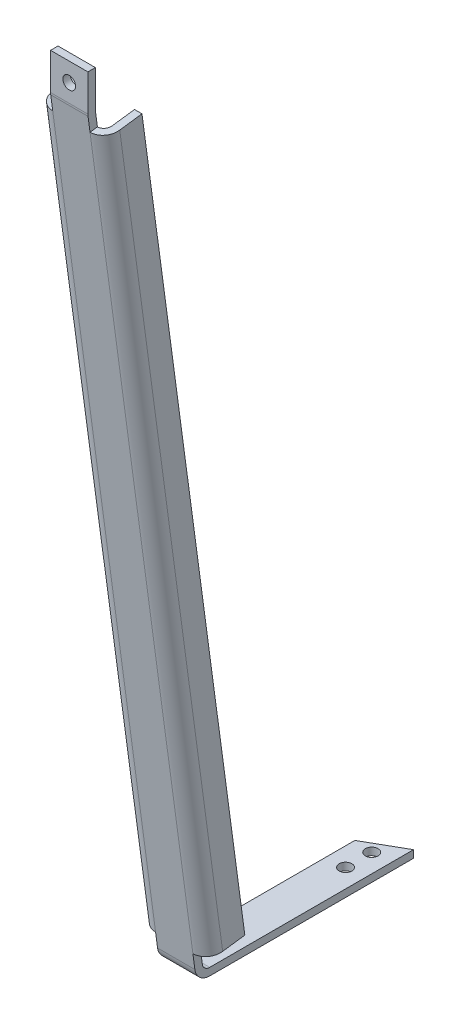
ISO-10303-21;
HEADER;
FILE_DESCRIPTION(('STEP AP214'),'2;1');
FILE_NAME('part.step','',(''),(''),'','','');
FILE_SCHEMA(('AUTOMOTIVE_DESIGN { 1 0 10303 214 1 1 1 1 }'));
ENDSEC;
DATA;
#1=APPLICATION_CONTEXT('core data for automotive mechanical design processes');
#2=APPLICATION_PROTOCOL_DEFINITION('international standard','automotive_design',2000,#1);
#3=PRODUCT_CONTEXT('',#1,'mechanical');
#4=PRODUCT('Part','Part','',(#3));
#5=PRODUCT_RELATED_PRODUCT_CATEGORY('part','',(#4));
#6=PRODUCT_DEFINITION_FORMATION('','',#4);
#7=PRODUCT_DEFINITION_CONTEXT('part definition',#1,'design');
#8=PRODUCT_DEFINITION('design','',#6,#7);
#9=PRODUCT_DEFINITION_SHAPE('','',#8);
#10=(LENGTH_UNIT() NAMED_UNIT(*) SI_UNIT(.MILLI.,.METRE.));
#11=(NAMED_UNIT(*) PLANE_ANGLE_UNIT() SI_UNIT($,.RADIAN.));
#12=(NAMED_UNIT(*) SI_UNIT($,.STERADIAN.) SOLID_ANGLE_UNIT());
#13=UNCERTAINTY_MEASURE_WITH_UNIT(LENGTH_MEASURE(1.E-05),#10,'distance_accuracy_value','');
#14=(GEOMETRIC_REPRESENTATION_CONTEXT(3) GLOBAL_UNCERTAINTY_ASSIGNED_CONTEXT((#13)) GLOBAL_UNIT_ASSIGNED_CONTEXT((#10,
#11,#12)) REPRESENTATION_CONTEXT('',''));
#15=CARTESIAN_POINT('',(0.,0.,0.));
#16=DIRECTION('',(0.,0.,1.));
#17=DIRECTION('',(1.,0.,0.));
#18=AXIS2_PLACEMENT_3D('',#15,#16,#17);
#19=CARTESIAN_POINT('',(-250.,68.,77.3774837469467));
#20=DIRECTION('',(1.,0.,0.));
#21=DIRECTION('',(0.,0.,-1.));
#22=AXIS2_PLACEMENT_3D('',#19,#20,#21);
#23=PLANE('',#22);
#24=DIRECTION('',(0.,-0.991025466347899,-0.133673202437623));
#25=VECTOR('',#24,1.);
#26=CARTESIAN_POINT('',(-250.,67.4653071902495,81.3415856123383));
#27=LINE('',#26,#25);
#28=CARTESIAN_POINT('',(-250.,279.666720790473,109.964101865392));
#29=VERTEX_POINT('',#28);
#30=CARTESIAN_POINT('',(-250.,275.702618925081,109.429409055641));
#31=VERTEX_POINT('',#30);
#32=EDGE_CURVE('E410',#29,#31,#27,.T.);
#33=ORIENTED_EDGE('',*,*,#32,.T.);
#34=DIRECTION('',(0.,0.133673202437623,-0.991025466347899));
#35=VECTOR('',#34,1.);
#36=CARTESIAN_POINT('',(-250.,276.237311734832,105.465307190249));
#37=LINE('',#36,#35);
#38=CARTESIAN_POINT('',(-250.,275.969965329956,107.447358122945));
#39=VERTEX_POINT('',#38);
#40=EDGE_CURVE('E47',#31,#39,#37,.T.);
#41=ORIENTED_EDGE('',*,*,#40,.T.);
#42=DIRECTION('',(0.,0.991025466347899,0.133673202437624));
#43=VECTOR('',#42,1.);
#44=CARTESIAN_POINT('',(-250.,279.934067195348,107.982050932696));
#45=LINE('',#44,#43);
#46=CARTESIAN_POINT('',(-250.,279.934067195348,107.982050932696));
#47=VERTEX_POINT('',#46);
#48=EDGE_CURVE('E391',#39,#47,#45,.T.);
#49=ORIENTED_EDGE('',*,*,#48,.T.);
#50=CARTESIAN_POINT('',(-250.,280.201413600223,106.));
#51=DIRECTION('',(-1.,0.,0.));
#52=DIRECTION('',(0.,0.,-1.));
#53=AXIS2_PLACEMENT_3D('',#50,#51,#52);
#54=CIRCLE('',#53,2.00000000000001);
#55=CARTESIAN_POINT('',(-250.,280.201413600223,108.));
#56=VERTEX_POINT('',#55);
#57=EDGE_CURVE('E397',#47,#56,#54,.T.);
#58=ORIENTED_EDGE('',*,*,#57,.T.);
#59=DIRECTION('',(0.,1.,0.));
#60=VECTOR('',#59,1.);
#61=CARTESIAN_POINT('',(-250.,290.,108.));
#62=LINE('',#61,#60);
#63=CARTESIAN_POINT('',(-250.,290.,108.));
#64=VERTEX_POINT('',#63);
#65=EDGE_CURVE('E400',#56,#64,#62,.T.);
#66=ORIENTED_EDGE('',*,*,#65,.T.);
#67=DIRECTION('',(0.,0.,1.));
#68=VECTOR('',#67,1.);
#69=CARTESIAN_POINT('',(-250.,290.,110.));
#70=LINE('',#69,#68);
#71=CARTESIAN_POINT('',(-250.,290.,110.));
#72=VERTEX_POINT('',#71);
#73=EDGE_CURVE('E398',#64,#72,#70,.T.);
#74=ORIENTED_EDGE('',*,*,#73,.T.);
#75=DIRECTION('',(0.,-1.,0.));
#76=VECTOR('',#75,1.);
#77=CARTESIAN_POINT('',(-250.,280.201413600223,110.));
#78=LINE('',#77,#76);
#79=CARTESIAN_POINT('',(-250.,280.201413600223,110.));
#80=VERTEX_POINT('',#79);
#81=EDGE_CURVE('E405',#72,#80,#78,.T.);
#82=ORIENTED_EDGE('',*,*,#81,.T.);
#83=CARTESIAN_POINT('',(-250.,280.201413600223,106.));
#84=DIRECTION('',(1.,0.,0.));
#85=DIRECTION('',(0.,0.,-1.));
#86=AXIS2_PLACEMENT_3D('',#83,#84,#85);
#87=CIRCLE('',#86,3.99999999999999);
#88=EDGE_CURVE('E404',#80,#29,#87,.T.);
#89=ORIENTED_EDGE('',*,*,#88,.T.);
#90=EDGE_LOOP('',(#33,#41,#49,#58,#66,#74,#82,#89));
#91=FACE_BOUND('',#90,.T.);
#92=ADVANCED_FACE('F41',(#91),#23,.T.);
#93=CARTESIAN_POINT('',(-260.,68.,77.3774837469467));
#94=DIRECTION('',(1.,0.,0.));
#95=DIRECTION('',(0.,0.,-1.));
#96=AXIS2_PLACEMENT_3D('',#93,#94,#95);
#97=PLANE('',#96);
#98=DIRECTION('',(0.,0.133673202437623,-0.991025466347899));
#99=VECTOR('',#98,1.);
#100=CARTESIAN_POINT('',(-260.,276.237311734832,105.465307190249));
#101=LINE('',#100,#99);
#102=CARTESIAN_POINT('',(-260.,275.702618925081,109.429409055641));
#103=VERTEX_POINT('',#102);
#104=CARTESIAN_POINT('',(-260.,275.969965329956,107.447358122945));
#105=VERTEX_POINT('',#104);
#106=EDGE_CURVE('E285',#103,#105,#101,.T.);
#107=ORIENTED_EDGE('',*,*,#106,.F.);
#108=DIRECTION('',(0.,-0.991025466347899,-0.133673202437623));
#109=VECTOR('',#108,1.);
#110=CARTESIAN_POINT('',(-260.,67.4653071902495,81.3415856123383));
#111=LINE('',#110,#109);
#112=CARTESIAN_POINT('',(-260.,279.666720790473,109.964101865392));
#113=VERTEX_POINT('',#112);
#114=EDGE_CURVE('E241',#113,#103,#111,.T.);
#115=ORIENTED_EDGE('',*,*,#114,.F.);
#116=CARTESIAN_POINT('',(-260.,280.201413600223,106.));
#117=DIRECTION('',(1.,0.,0.));
#118=DIRECTION('',(0.,0.,-1.));
#119=AXIS2_PLACEMENT_3D('',#116,#117,#118);
#120=CIRCLE('',#119,3.99999999999999);
#121=CARTESIAN_POINT('',(-260.,280.201413600223,110.));
#122=VERTEX_POINT('',#121);
#123=EDGE_CURVE('E238',#122,#113,#120,.T.);
#124=ORIENTED_EDGE('',*,*,#123,.F.);
#125=DIRECTION('',(0.,-1.,0.));
#126=VECTOR('',#125,1.);
#127=CARTESIAN_POINT('',(-260.,280.201413600223,110.));
#128=LINE('',#127,#126);
#129=CARTESIAN_POINT('',(-260.,290.,110.));
#130=VERTEX_POINT('',#129);
#131=EDGE_CURVE('E236',#130,#122,#128,.T.);
#132=ORIENTED_EDGE('',*,*,#131,.F.);
#133=DIRECTION('',(0.,0.,1.));
#134=VECTOR('',#133,1.);
#135=CARTESIAN_POINT('',(-260.,290.,110.));
#136=LINE('',#135,#134);
#137=CARTESIAN_POINT('',(-260.,290.,108.));
#138=VERTEX_POINT('',#137);
#139=EDGE_CURVE('E237',#138,#130,#136,.T.);
#140=ORIENTED_EDGE('',*,*,#139,.F.);
#141=DIRECTION('',(0.,1.,0.));
#142=VECTOR('',#141,1.);
#143=CARTESIAN_POINT('',(-260.,290.,108.));
#144=LINE('',#143,#142);
#145=CARTESIAN_POINT('',(-260.,280.201413600223,108.));
#146=VERTEX_POINT('',#145);
#147=EDGE_CURVE('E231',#146,#138,#144,.T.);
#148=ORIENTED_EDGE('',*,*,#147,.F.);
#149=CARTESIAN_POINT('',(-260.,280.201413600223,106.));
#150=DIRECTION('',(-1.,0.,0.));
#151=DIRECTION('',(0.,0.,-1.));
#152=AXIS2_PLACEMENT_3D('',#149,#150,#151);
#153=CIRCLE('',#152,2.00000000000001);
#154=CARTESIAN_POINT('',(-260.,279.934067195348,107.982050932696));
#155=VERTEX_POINT('',#154);
#156=EDGE_CURVE('E234',#155,#146,#153,.T.);
#157=ORIENTED_EDGE('',*,*,#156,.F.);
#158=DIRECTION('',(0.,0.991025466347899,0.133673202437624));
#159=VECTOR('',#158,1.);
#160=CARTESIAN_POINT('',(-260.,279.934067195348,107.982050932696));
#161=LINE('',#160,#159);
#162=EDGE_CURVE('E219',#105,#155,#161,.T.);
#163=ORIENTED_EDGE('',*,*,#162,.F.);
#164=EDGE_LOOP('',(#107,#115,#124,#132,#140,#148,#157,#163));
#165=FACE_BOUND('',#164,.T.);
#166=ADVANCED_FACE('F440',(#165),#97,.F.);
#167=CARTESIAN_POINT('',(-250.,66.,77.3774837469467));
#168=DIRECTION('',(0.,-1.,0.));
#169=DIRECTION('',(0.,0.,-1.));
#170=AXIS2_PLACEMENT_3D('',#167,#168,#169);
#171=PLANE('',#170);
#172=CARTESIAN_POINT('',(-255.,66.,29.));
#173=DIRECTION('',(0.,-1.,0.));
#174=DIRECTION('',(0.,0.,-1.));
#175=AXIS2_PLACEMENT_3D('',#172,#173,#174);
#176=CIRCLE('',#175,1.69999999999998);
#177=CARTESIAN_POINT('',(-255.,66.,27.3));
#178=VERTEX_POINT('',#177);
#179=EDGE_CURVE('E291',#178,#178,#176,.T.);
#180=ORIENTED_EDGE('',*,*,#179,.T.);
#181=EDGE_LOOP('',(#180));
#182=FACE_BOUND('',#181,.T.);
#183=CARTESIAN_POINT('',(-255.,66.,36.));
#184=DIRECTION('',(0.,-1.,0.));
#185=DIRECTION('',(0.,0.,-1.));
#186=AXIS2_PLACEMENT_3D('',#183,#184,#185);
#187=CIRCLE('',#186,1.69999999999998);
#188=CARTESIAN_POINT('',(-255.,66.,34.3));
#189=VERTEX_POINT('',#188);
#190=EDGE_CURVE('E286',#189,#189,#187,.T.);
#191=ORIENTED_EDGE('',*,*,#190,.T.);
#192=EDGE_LOOP('',(#191));
#193=FACE_BOUND('',#192,.T.);
#194=DIRECTION('',(0.,0.,1.));
#195=VECTOR('',#194,1.);
#196=CARTESIAN_POINT('',(-250.,66.,77.3774837469467));
#197=LINE('',#196,#195);
#198=CARTESIAN_POINT('',(-250.,66.,22.8));
#199=VERTEX_POINT('',#198);
#200=CARTESIAN_POINT('',(-250.,66.,77.3774837469467));
#201=VERTEX_POINT('',#200);
#202=EDGE_CURVE('E211',#199,#201,#197,.T.);
#203=ORIENTED_EDGE('',*,*,#202,.F.);
#204=DIRECTION('',(-0.868777270192661,0.,0.495203044009816));
#205=VECTOR('',#204,1.);
#206=CARTESIAN_POINT('',(-273.480387754366,66.,36.1838210199886));
#207=LINE('',#206,#205);
#208=CARTESIAN_POINT('',(-260.,66.,28.5));
#209=VERTEX_POINT('',#208);
#210=EDGE_CURVE('E199',#199,#209,#207,.T.);
#211=ORIENTED_EDGE('',*,*,#210,.T.);
#212=DIRECTION('',(0.,0.,1.));
#213=VECTOR('',#212,1.);
#214=CARTESIAN_POINT('',(-260.,66.,77.3774837469467));
#215=LINE('',#214,#213);
#216=CARTESIAN_POINT('',(-260.,66.,77.3774837469467));
#217=VERTEX_POINT('',#216);
#218=EDGE_CURVE('E207',#209,#217,#215,.T.);
#219=ORIENTED_EDGE('',*,*,#218,.T.);
#220=DIRECTION('',(-1.,0.,0.));
#221=VECTOR('',#220,1.);
#222=CARTESIAN_POINT('',(-250.,66.,77.3774837469467));
#223=LINE('',#222,#221);
#224=EDGE_CURVE('E280',#201,#217,#223,.T.);
#225=ORIENTED_EDGE('',*,*,#224,.F.);
#226=EDGE_LOOP('',(#203,#211,#219,#225));
#227=FACE_BOUND('',#226,.T.);
#228=ADVANCED_FACE('F43',(#182,#193,#227),#171,.F.);
#229=CARTESIAN_POINT('',(-250.,68.,77.3774837469467));
#230=DIRECTION('',(-1.,0.,0.));
#231=DIRECTION('',(0.,0.,1.));
#232=AXIS2_PLACEMENT_3D('',#229,#230,#231);
#233=CYLINDRICAL_SURFACE('',#232,2.);
#234=CARTESIAN_POINT('',(-260.,68.,77.3774837469467));
#235=DIRECTION('',(-1.,0.,0.));
#236=DIRECTION('',(0.,0.,-1.));
#237=AXIS2_PLACEMENT_3D('',#234,#235,#236);
#238=CIRCLE('',#237,2.);
#239=CARTESIAN_POINT('',(-260.,67.7326535951247,79.3595346796425));
#240=VERTEX_POINT('',#239);
#241=EDGE_CURVE('E220',#217,#240,#238,.T.);
#242=ORIENTED_EDGE('',*,*,#241,.T.);
#243=DIRECTION('',(-1.,0.,0.));
#244=VECTOR('',#243,1.);
#245=CARTESIAN_POINT('',(-250.,67.7326535951247,79.3595346796425));
#246=LINE('',#245,#244);
#247=CARTESIAN_POINT('',(-250.,67.7326535951247,79.3595346796425));
#248=VERTEX_POINT('',#247);
#249=EDGE_CURVE('E273',#248,#240,#246,.T.);
#250=ORIENTED_EDGE('',*,*,#249,.F.);
#251=CARTESIAN_POINT('',(-250.,68.,77.3774837469467));
#252=DIRECTION('',(-1.,0.,0.));
#253=DIRECTION('',(0.,0.,-1.));
#254=AXIS2_PLACEMENT_3D('',#251,#252,#253);
#255=CIRCLE('',#254,2.);
#256=EDGE_CURVE('E393',#201,#248,#255,.T.);
#257=ORIENTED_EDGE('',*,*,#256,.F.);
#258=ORIENTED_EDGE('',*,*,#224,.T.);
#259=EDGE_LOOP('',(#242,#250,#257,#258));
#260=FACE_BOUND('',#259,.T.);
#261=ADVANCED_FACE('F516',(#260),#233,.F.);
#262=CARTESIAN_POINT('',(-250.,279.934067195348,107.982050932696));
#263=DIRECTION('',(0.,-0.133673202437624,0.991025466347899));
#264=DIRECTION('',(0.,-0.991025466347899,-0.133673202437624));
#265=AXIS2_PLACEMENT_3D('',#262,#263,#264);
#266=PLANE('',#265);
#267=ORIENTED_EDGE('',*,*,#48,.F.);
#268=DIRECTION('',(0.,-0.991025466347899,-0.133673202437623));
#269=VECTOR('',#268,1.);
#270=CARTESIAN_POINT('',(-250.,275.969965329956,107.447358122945));
#271=LINE('',#270,#269);
#272=CARTESIAN_POINT('',(-250.,71.6967554605164,79.894227489393));
#273=VERTEX_POINT('',#272);
#274=EDGE_CURVE('E355',#39,#273,#271,.T.);
#275=ORIENTED_EDGE('',*,*,#274,.T.);
#276=EDGE_CURVE('E394',#248,#273,#45,.T.);
#277=ORIENTED_EDGE('',*,*,#276,.F.);
#278=ORIENTED_EDGE('',*,*,#249,.T.);
#279=CARTESIAN_POINT('',(-260.,71.6967554605163,79.894227489393));
#280=VERTEX_POINT('',#279);
#281=EDGE_CURVE('E229',#240,#280,#161,.T.);
#282=ORIENTED_EDGE('',*,*,#281,.T.);
#283=DIRECTION('',(0.,-0.991025466347899,-0.133673202437623));
#284=VECTOR('',#283,1.);
#285=CARTESIAN_POINT('',(-260.,275.969965329956,107.447358122945));
#286=LINE('',#285,#284);
#287=EDGE_CURVE('E224',#105,#280,#286,.T.);
#288=ORIENTED_EDGE('',*,*,#287,.F.);
#289=ORIENTED_EDGE('',*,*,#162,.T.);
#290=DIRECTION('',(-1.,0.,0.));
#291=VECTOR('',#290,1.);
#292=CARTESIAN_POINT('',(-250.,279.934067195348,107.982050932696));
#293=LINE('',#292,#291);
#294=EDGE_CURVE('E271',#47,#155,#293,.T.);
#295=ORIENTED_EDGE('',*,*,#294,.F.);
#296=EDGE_LOOP('',(#267,#275,#277,#278,#282,#288,#289,#295));
#297=FACE_BOUND('',#296,.T.);
#298=ADVANCED_FACE('F443',(#297),#266,.F.);
#299=CARTESIAN_POINT('',(-250.,280.201413600223,106.));
#300=DIRECTION('',(-1.,0.,0.));
#301=DIRECTION('',(0.,0.,1.));
#302=AXIS2_PLACEMENT_3D('',#299,#300,#301);
#303=CYLINDRICAL_SURFACE('',#302,2.00000000000001);
#304=ORIENTED_EDGE('',*,*,#156,.T.);
#305=DIRECTION('',(-1.,0.,0.));
#306=VECTOR('',#305,1.);
#307=CARTESIAN_POINT('',(-250.,280.201413600223,108.));
#308=LINE('',#307,#306);
#309=EDGE_CURVE('E268',#56,#146,#308,.T.);
#310=ORIENTED_EDGE('',*,*,#309,.F.);
#311=ORIENTED_EDGE('',*,*,#57,.F.);
#312=ORIENTED_EDGE('',*,*,#294,.T.);
#313=EDGE_LOOP('',(#304,#310,#311,#312));
#314=FACE_BOUND('',#313,.T.);
#315=ADVANCED_FACE('F515',(#314),#303,.F.);
#316=CARTESIAN_POINT('',(-250.,290.,108.));
#317=DIRECTION('',(0.,0.,1.));
#318=DIRECTION('',(1.,0.,0.));
#319=AXIS2_PLACEMENT_3D('',#316,#317,#318);
#320=PLANE('',#319);
#321=CARTESIAN_POINT('',(-255.,285.,108.));
#322=DIRECTION('',(0.,0.,1.));
#323=DIRECTION('',(1.,0.,0.));
#324=AXIS2_PLACEMENT_3D('',#321,#322,#323);
#325=CIRCLE('',#324,1.69999999999998);
#326=CARTESIAN_POINT('',(-253.3,285.,108.));
#327=VERTEX_POINT('',#326);
#328=EDGE_CURVE('E288',#327,#327,#325,.F.);
#329=ORIENTED_EDGE('',*,*,#328,.F.);
#330=EDGE_LOOP('',(#329));
#331=FACE_BOUND('',#330,.T.);
#332=ORIENTED_EDGE('',*,*,#147,.T.);
#333=DIRECTION('',(-1.,0.,0.));
#334=VECTOR('',#333,1.);
#335=CARTESIAN_POINT('',(-250.,290.,108.));
#336=LINE('',#335,#334);
#337=EDGE_CURVE('E264',#64,#138,#336,.T.);
#338=ORIENTED_EDGE('',*,*,#337,.F.);
#339=ORIENTED_EDGE('',*,*,#65,.F.);
#340=ORIENTED_EDGE('',*,*,#309,.T.);
#341=EDGE_LOOP('',(#332,#338,#339,#340));
#342=FACE_BOUND('',#341,.T.);
#343=ADVANCED_FACE('F510',(#331,#342),#320,.F.);
#344=CARTESIAN_POINT('',(-250.,290.,110.));
#345=DIRECTION('',(0.,-1.,0.));
#346=DIRECTION('',(0.,0.,-1.));
#347=AXIS2_PLACEMENT_3D('',#344,#345,#346);
#348=PLANE('',#347);
#349=ORIENTED_EDGE('',*,*,#139,.T.);
#350=DIRECTION('',(-1.,0.,0.));
#351=VECTOR('',#350,1.);
#352=CARTESIAN_POINT('',(-250.,290.,110.));
#353=LINE('',#352,#351);
#354=EDGE_CURVE('E265',#72,#130,#353,.T.);
#355=ORIENTED_EDGE('',*,*,#354,.F.);
#356=ORIENTED_EDGE('',*,*,#73,.F.);
#357=ORIENTED_EDGE('',*,*,#337,.T.);
#358=EDGE_LOOP('',(#349,#355,#356,#357));
#359=FACE_BOUND('',#358,.T.);
#360=ADVANCED_FACE('F504',(#359),#348,.F.);
#361=CARTESIAN_POINT('',(-250.,280.201413600223,110.));
#362=DIRECTION('',(0.,0.,-1.));
#363=DIRECTION('',(0.,1.,0.));
#364=AXIS2_PLACEMENT_3D('',#361,#362,#363);
#365=PLANE('',#364);
#366=CARTESIAN_POINT('',(-255.,285.,110.));
#367=DIRECTION('',(0.,0.,-1.));
#368=DIRECTION('',(0.,1.,0.));
#369=AXIS2_PLACEMENT_3D('',#366,#367,#368);
#370=CIRCLE('',#369,1.69999999999998);
#371=CARTESIAN_POINT('',(-255.,286.7,110.));
#372=VERTEX_POINT('',#371);
#373=EDGE_CURVE('E294',#372,#372,#370,.F.);
#374=ORIENTED_EDGE('',*,*,#373,.F.);
#375=EDGE_LOOP('',(#374));
#376=FACE_BOUND('',#375,.T.);
#377=ORIENTED_EDGE('',*,*,#131,.T.);
#378=DIRECTION('',(-1.,0.,0.));
#379=VECTOR('',#378,1.);
#380=CARTESIAN_POINT('',(-250.,280.201413600223,110.));
#381=LINE('',#380,#379);
#382=EDGE_CURVE('E259',#80,#122,#381,.T.);
#383=ORIENTED_EDGE('',*,*,#382,.F.);
#384=ORIENTED_EDGE('',*,*,#81,.F.);
#385=ORIENTED_EDGE('',*,*,#354,.T.);
#386=EDGE_LOOP('',(#377,#383,#384,#385));
#387=FACE_BOUND('',#386,.T.);
#388=ADVANCED_FACE('F498',(#376,#387),#365,.F.);
#389=CARTESIAN_POINT('',(-250.,280.201413600223,106.));
#390=DIRECTION('',(-1.,0.,0.));
#391=DIRECTION('',(0.,0.,1.));
#392=AXIS2_PLACEMENT_3D('',#389,#390,#391);
#393=CYLINDRICAL_SURFACE('',#392,3.99999999999999);
#394=ORIENTED_EDGE('',*,*,#123,.T.);
#395=DIRECTION('',(-1.,0.,0.));
#396=VECTOR('',#395,1.);
#397=CARTESIAN_POINT('',(-250.,279.666720790473,109.964101865392));
#398=LINE('',#397,#396);
#399=EDGE_CURVE('E258',#29,#113,#398,.T.);
#400=ORIENTED_EDGE('',*,*,#399,.F.);
#401=ORIENTED_EDGE('',*,*,#88,.F.);
#402=ORIENTED_EDGE('',*,*,#382,.T.);
#403=EDGE_LOOP('',(#394,#400,#401,#402));
#404=FACE_BOUND('',#403,.T.);
#405=ADVANCED_FACE('F500',(#404),#393,.T.);
#406=CARTESIAN_POINT('',(-250.,67.4653071902495,81.3415856123383));
#407=DIRECTION('',(0.,0.133673202437623,-0.991025466347899));
#408=DIRECTION('',(0.,0.991025466347899,0.133673202437623));
#409=AXIS2_PLACEMENT_3D('',#406,#407,#408);
#410=PLANE('',#409);
#411=DIRECTION('',(0.,-0.991025466347899,-0.133673202437623));
#412=VECTOR('',#411,1.);
#413=CARTESIAN_POINT('',(-260.,275.702618925081,109.429409055641));
#414=LINE('',#413,#412);
#415=CARTESIAN_POINT('',(-260.,71.4294090556411,81.8762784220888));
#416=VERTEX_POINT('',#415);
#417=EDGE_CURVE('E217',#103,#416,#414,.T.);
#418=ORIENTED_EDGE('',*,*,#417,.T.);
#419=CARTESIAN_POINT('',(-260.,67.4653071902495,81.3415856123383));
#420=VERTEX_POINT('',#419);
#421=EDGE_CURVE('E245',#416,#420,#111,.T.);
#422=ORIENTED_EDGE('',*,*,#421,.T.);
#423=DIRECTION('',(-1.,0.,0.));
#424=VECTOR('',#423,1.);
#425=CARTESIAN_POINT('',(-250.,67.4653071902495,81.3415856123383));
#426=LINE('',#425,#424);
#427=CARTESIAN_POINT('',(-250.,67.4653071902495,81.3415856123383));
#428=VERTEX_POINT('',#427);
#429=EDGE_CURVE('E251',#428,#420,#426,.T.);
#430=ORIENTED_EDGE('',*,*,#429,.F.);
#431=CARTESIAN_POINT('',(-250.,71.4294090556411,81.8762784220888));
#432=VERTEX_POINT('',#431);
#433=EDGE_CURVE('E408',#432,#428,#27,.T.);
#434=ORIENTED_EDGE('',*,*,#433,.F.);
#435=DIRECTION('',(0.,-0.991025466347899,-0.133673202437623));
#436=VECTOR('',#435,1.);
#437=CARTESIAN_POINT('',(-250.,275.702618925081,109.429409055641));
#438=LINE('',#437,#436);
#439=EDGE_CURVE('E346',#31,#432,#438,.T.);
#440=ORIENTED_EDGE('',*,*,#439,.F.);
#441=ORIENTED_EDGE('',*,*,#32,.F.);
#442=ORIENTED_EDGE('',*,*,#399,.T.);
#443=ORIENTED_EDGE('',*,*,#114,.T.);
#444=EDGE_LOOP('',(#418,#422,#430,#434,#440,#441,#442,#443));
#445=FACE_BOUND('',#444,.T.);
#446=ADVANCED_FACE('F421',(#445),#410,.F.);
#447=CARTESIAN_POINT('',(-250.,68.,77.3774837469467));
#448=DIRECTION('',(-1.,0.,0.));
#449=DIRECTION('',(0.,0.,1.));
#450=AXIS2_PLACEMENT_3D('',#447,#448,#449);
#451=CYLINDRICAL_SURFACE('',#450,4.00000000000001);
#452=CARTESIAN_POINT('',(-260.,68.,77.3774837469467));
#453=DIRECTION('',(1.,0.,0.));
#454=DIRECTION('',(0.,0.,-1.));
#455=AXIS2_PLACEMENT_3D('',#452,#453,#454);
#456=CIRCLE('',#455,4.00000000000001);
#457=CARTESIAN_POINT('',(-260.,64.,77.3774837469467));
#458=VERTEX_POINT('',#457);
#459=EDGE_CURVE('E247',#420,#458,#456,.T.);
#460=ORIENTED_EDGE('',*,*,#459,.T.);
#461=DIRECTION('',(-1.,0.,0.));
#462=VECTOR('',#461,1.);
#463=CARTESIAN_POINT('',(-250.,64.,77.3774837469467));
#464=LINE('',#463,#462);
#465=CARTESIAN_POINT('',(-250.,64.,77.3774837469467));
#466=VERTEX_POINT('',#465);
#467=EDGE_CURVE('E248',#466,#458,#464,.T.);
#468=ORIENTED_EDGE('',*,*,#467,.F.);
#469=CARTESIAN_POINT('',(-250.,68.,77.3774837469467));
#470=DIRECTION('',(1.,0.,0.));
#471=DIRECTION('',(0.,0.,-1.));
#472=AXIS2_PLACEMENT_3D('',#469,#470,#471);
#473=CIRCLE('',#472,4.00000000000001);
#474=EDGE_CURVE('E409',#428,#466,#473,.T.);
#475=ORIENTED_EDGE('',*,*,#474,.F.);
#476=ORIENTED_EDGE('',*,*,#429,.T.);
#477=EDGE_LOOP('',(#460,#468,#475,#476));
#478=FACE_BOUND('',#477,.T.);
#479=ADVANCED_FACE('F419',(#478),#451,.T.);
#480=CARTESIAN_POINT('',(-250.,64.,22.));
#481=DIRECTION('',(0.,1.,0.));
#482=DIRECTION('',(0.,0.,1.));
#483=AXIS2_PLACEMENT_3D('',#480,#481,#482);
#484=PLANE('',#483);
#485=CARTESIAN_POINT('',(-255.,64.,29.));
#486=DIRECTION('',(0.,1.,0.));
#487=DIRECTION('',(0.,0.,1.));
#488=AXIS2_PLACEMENT_3D('',#485,#486,#487);
#489=CIRCLE('',#488,1.69999999999998);
#490=CARTESIAN_POINT('',(-255.,64.,30.7));
#491=VERTEX_POINT('',#490);
#492=EDGE_CURVE('E292',#491,#491,#489,.T.);
#493=ORIENTED_EDGE('',*,*,#492,.T.);
#494=EDGE_LOOP('',(#493));
#495=FACE_BOUND('',#494,.T.);
#496=CARTESIAN_POINT('',(-255.,64.,36.));
#497=DIRECTION('',(0.,1.,0.));
#498=DIRECTION('',(0.,0.,1.));
#499=AXIS2_PLACEMENT_3D('',#496,#497,#498);
#500=CIRCLE('',#499,1.69999999999998);
#501=CARTESIAN_POINT('',(-255.,64.,37.7));
#502=VERTEX_POINT('',#501);
#503=EDGE_CURVE('E287',#502,#502,#500,.T.);
#504=ORIENTED_EDGE('',*,*,#503,.T.);
#505=EDGE_LOOP('',(#504));
#506=FACE_BOUND('',#505,.T.);
#507=DIRECTION('',(0.,0.,-1.));
#508=VECTOR('',#507,1.);
#509=CARTESIAN_POINT('',(-260.,64.,22.));
#510=LINE('',#509,#508);
#511=CARTESIAN_POINT('',(-260.,64.,28.5));
#512=VERTEX_POINT('',#511);
#513=EDGE_CURVE('E250',#458,#512,#510,.T.);
#514=ORIENTED_EDGE('',*,*,#513,.T.);
#515=DIRECTION('',(0.868777270192661,0.,-0.495203044009816));
#516=VECTOR('',#515,1.);
#517=CARTESIAN_POINT('',(-249.655823080987,64.,22.6038191561627));
#518=LINE('',#517,#516);
#519=CARTESIAN_POINT('',(-250.,64.,22.8));
#520=VERTEX_POINT('',#519);
#521=EDGE_CURVE('E57',#512,#520,#518,.T.);
#522=ORIENTED_EDGE('',*,*,#521,.T.);
#523=DIRECTION('',(0.,0.,-1.));
#524=VECTOR('',#523,1.);
#525=CARTESIAN_POINT('',(-250.,64.,22.));
#526=LINE('',#525,#524);
#527=EDGE_CURVE('E228',#466,#520,#526,.T.);
#528=ORIENTED_EDGE('',*,*,#527,.F.);
#529=ORIENTED_EDGE('',*,*,#467,.T.);
#530=EDGE_LOOP('',(#514,#522,#528,#529));
#531=FACE_BOUND('',#530,.T.);
#532=ADVANCED_FACE('F418',(#495,#506,#531),#484,.F.);
#533=DIRECTION('',(0.,-1.,0.));
#534=VECTOR('',#533,1.);
#535=CARTESIAN_POINT('',(-250.,68.,22.8));
#536=LINE('',#535,#534);
#537=EDGE_CURVE('E215',#199,#520,#536,.T.);
#538=ORIENTED_EDGE('',*,*,#537,.F.);
#539=ORIENTED_EDGE('',*,*,#202,.T.);
#540=ORIENTED_EDGE('',*,*,#256,.T.);
#541=ORIENTED_EDGE('',*,*,#276,.T.);
#542=DIRECTION('',(0.,0.133673202437623,-0.991025466347899));
#543=VECTOR('',#542,1.);
#544=CARTESIAN_POINT('',(-250.,71.9641018653916,77.9121765566972));
#545=LINE('',#544,#543);
#546=EDGE_CURVE('E61',#432,#273,#545,.T.);
#547=ORIENTED_EDGE('',*,*,#546,.F.);
#548=ORIENTED_EDGE('',*,*,#433,.T.);
#549=ORIENTED_EDGE('',*,*,#474,.T.);
#550=ORIENTED_EDGE('',*,*,#527,.T.);
#551=EDGE_LOOP('',(#538,#539,#540,#541,#547,#548,#549,#550));
#552=FACE_BOUND('',#551,.T.);
#553=ADVANCED_FACE('F411',(#552),#23,.T.);
#554=ORIENTED_EDGE('',*,*,#218,.F.);
#555=DIRECTION('',(0.,-1.,0.));
#556=VECTOR('',#555,1.);
#557=CARTESIAN_POINT('',(-260.,68.,28.5));
#558=LINE('',#557,#556);
#559=EDGE_CURVE('E11',#209,#512,#558,.T.);
#560=ORIENTED_EDGE('',*,*,#559,.T.);
#561=ORIENTED_EDGE('',*,*,#513,.F.);
#562=ORIENTED_EDGE('',*,*,#459,.F.);
#563=ORIENTED_EDGE('',*,*,#421,.F.);
#564=DIRECTION('',(0.,0.133673202437623,-0.991025466347899));
#565=VECTOR('',#564,1.);
#566=CARTESIAN_POINT('',(-260.,71.9641018653916,77.9121765566972));
#567=LINE('',#566,#565);
#568=EDGE_CURVE('E276',#416,#280,#567,.T.);
#569=ORIENTED_EDGE('',*,*,#568,.T.);
#570=ORIENTED_EDGE('',*,*,#281,.F.);
#571=ORIENTED_EDGE('',*,*,#241,.F.);
#572=EDGE_LOOP('',(#554,#560,#561,#562,#563,#569,#570,#571));
#573=FACE_BOUND('',#572,.T.);
#574=ADVANCED_FACE('F214',(#573),#97,.F.);
#575=CARTESIAN_POINT('',(-260.,276.237311734832,105.465307190249));
#576=DIRECTION('',(0.,-0.991025466347899,-0.133673202437623));
#577=DIRECTION('',(0.,0.133673202437623,-0.991025466347899));
#578=AXIS2_PLACEMENT_3D('',#575,#576,#577);
#579=PLANE('',#578);
#580=CARTESIAN_POINT('',(-260.,276.237311734832,105.465307190249));
#581=DIRECTION('',(0.,-0.991025466347899,-0.133673202437623));
#582=DIRECTION('',(0.,0.133673202437623,-0.991025466347899));
#583=AXIS2_PLACEMENT_3D('',#580,#581,#582);
#584=CIRCLE('',#583,4.00000000000001);
#585=CARTESIAN_POINT('',(-264.,276.237311734832,105.465307190249));
#586=VERTEX_POINT('',#585);
#587=EDGE_CURVE('E306',#103,#586,#584,.T.);
#588=ORIENTED_EDGE('',*,*,#587,.F.);
#589=ORIENTED_EDGE('',*,*,#106,.T.);
#590=CARTESIAN_POINT('',(-260.,276.237311734832,105.465307190249));
#591=DIRECTION('',(0.,0.991025466347899,0.133673202437623));
#592=DIRECTION('',(0.,0.133673202437623,-0.991025466347899));
#593=AXIS2_PLACEMENT_3D('',#590,#591,#592);
#594=CIRCLE('',#593,2.00000000000001);
#595=CARTESIAN_POINT('',(-262.,276.237311734832,105.465307190249));
#596=VERTEX_POINT('',#595);
#597=EDGE_CURVE('E321',#596,#105,#594,.T.);
#598=ORIENTED_EDGE('',*,*,#597,.F.);
#599=DIRECTION('',(0.,-0.133673202437623,0.991025466347899));
#600=VECTOR('',#599,1.);
#601=CARTESIAN_POINT('',(-262.,277.039350949457,99.519154392162));
#602=LINE('',#601,#600);
#603=CARTESIAN_POINT('',(-262.,277.039350949457,99.519154392162));
#604=VERTEX_POINT('',#603);
#605=EDGE_CURVE('E318',#604,#596,#602,.T.);
#606=ORIENTED_EDGE('',*,*,#605,.F.);
#607=DIRECTION('',(1.,0.,0.));
#608=VECTOR('',#607,1.);
#609=CARTESIAN_POINT('',(-264.,277.039350949457,99.519154392162));
#610=LINE('',#609,#608);
#611=CARTESIAN_POINT('',(-264.,277.039350949457,99.519154392162));
#612=VERTEX_POINT('',#611);
#613=EDGE_CURVE('E312',#612,#604,#610,.T.);
#614=ORIENTED_EDGE('',*,*,#613,.F.);
#615=DIRECTION('',(0.,0.133673202437623,-0.991025466347899));
#616=VECTOR('',#615,1.);
#617=CARTESIAN_POINT('',(-264.,276.237311734832,105.465307190249));
#618=LINE('',#617,#616);
#619=EDGE_CURVE('E313',#586,#612,#618,.T.);
#620=ORIENTED_EDGE('',*,*,#619,.F.);
#621=EDGE_LOOP('',(#588,#589,#598,#606,#614,#620));
#622=FACE_BOUND('',#621,.T.);
#623=ADVANCED_FACE('F435',(#622),#579,.F.);
#624=CARTESIAN_POINT('',(-260.,71.9641018653916,77.9121765566972));
#625=DIRECTION('',(0.,-0.991025466347899,-0.133673202437623));
#626=DIRECTION('',(0.,0.133673202437623,-0.991025466347899));
#627=AXIS2_PLACEMENT_3D('',#624,#625,#626);
#628=PLANE('',#627);
#629=ORIENTED_EDGE('',*,*,#568,.F.);
#630=CARTESIAN_POINT('',(-260.,71.9641018653916,77.9121765566972));
#631=DIRECTION('',(0.,-0.991025466347899,-0.133673202437623));
#632=DIRECTION('',(0.,0.133673202437623,-0.991025466347899));
#633=AXIS2_PLACEMENT_3D('',#630,#631,#632);
#634=CIRCLE('',#633,4.00000000000001);
#635=CARTESIAN_POINT('',(-264.,71.9641018653916,77.9121765566972));
#636=VERTEX_POINT('',#635);
#637=EDGE_CURVE('E324',#416,#636,#634,.T.);
#638=ORIENTED_EDGE('',*,*,#637,.T.);
#639=DIRECTION('',(0.,0.133673202437623,-0.991025466347899));
#640=VECTOR('',#639,1.);
#641=CARTESIAN_POINT('',(-264.,71.9641018653916,77.9121765566972));
#642=LINE('',#641,#640);
#643=CARTESIAN_POINT('',(-264.,72.7661410800173,71.9660237586098));
#644=VERTEX_POINT('',#643);
#645=EDGE_CURVE('E327',#636,#644,#642,.T.);
#646=ORIENTED_EDGE('',*,*,#645,.T.);
#647=DIRECTION('',(1.,0.,0.));
#648=VECTOR('',#647,1.);
#649=CARTESIAN_POINT('',(-264.,72.7661410800173,71.9660237586098));
#650=LINE('',#649,#648);
#651=CARTESIAN_POINT('',(-262.,72.7661410800173,71.9660237586098));
#652=VERTEX_POINT('',#651);
#653=EDGE_CURVE('E335',#644,#652,#650,.T.);
#654=ORIENTED_EDGE('',*,*,#653,.T.);
#655=DIRECTION('',(0.,-0.133673202437623,0.991025466347899));
#656=VECTOR('',#655,1.);
#657=CARTESIAN_POINT('',(-262.,72.7661410800173,71.9660237586098));
#658=LINE('',#657,#656);
#659=CARTESIAN_POINT('',(-262.,71.9641018653916,77.9121765566972));
#660=VERTEX_POINT('',#659);
#661=EDGE_CURVE('E333',#652,#660,#658,.T.);
#662=ORIENTED_EDGE('',*,*,#661,.T.);
#663=CARTESIAN_POINT('',(-260.,71.9641018653916,77.9121765566972));
#664=DIRECTION('',(0.,0.991025466347899,0.133673202437623));
#665=DIRECTION('',(0.,0.133673202437623,-0.991025466347899));
#666=AXIS2_PLACEMENT_3D('',#663,#664,#665);
#667=CIRCLE('',#666,2.00000000000001);
#668=EDGE_CURVE('E315',#660,#280,#667,.T.);
#669=ORIENTED_EDGE('',*,*,#668,.T.);
#670=EDGE_LOOP('',(#629,#638,#646,#654,#662,#669));
#671=FACE_BOUND('',#670,.T.);
#672=ADVANCED_FACE('F447',(#671),#628,.T.);
#673=CARTESIAN_POINT('',(-260.,276.237311734832,105.465307190249));
#674=DIRECTION('',(0.,-0.991025466347899,-0.133673202437623));
#675=DIRECTION('',(0.,0.133673202437623,-0.991025466347899));
#676=AXIS2_PLACEMENT_3D('',#673,#674,#675);
#677=CYLINDRICAL_SURFACE('',#676,4.00000000000001);
#678=ORIENTED_EDGE('',*,*,#637,.F.);
#679=ORIENTED_EDGE('',*,*,#417,.F.);
#680=ORIENTED_EDGE('',*,*,#587,.T.);
#681=DIRECTION('',(0.,-0.991025466347899,-0.133673202437623));
#682=VECTOR('',#681,1.);
#683=CARTESIAN_POINT('',(-264.,276.237311734832,105.465307190249));
#684=LINE('',#683,#682);
#685=EDGE_CURVE('E322',#586,#636,#684,.T.);
#686=ORIENTED_EDGE('',*,*,#685,.T.);
#687=EDGE_LOOP('',(#678,#679,#680,#686));
#688=FACE_BOUND('',#687,.T.);
#689=ADVANCED_FACE('F428',(#688),#677,.T.);
#690=CARTESIAN_POINT('',(-260.,276.237311734832,105.465307190249));
#691=DIRECTION('',(0.,-0.991025466347899,-0.133673202437623));
#692=DIRECTION('',(0.,0.133673202437623,-0.991025466347899));
#693=AXIS2_PLACEMENT_3D('',#690,#691,#692);
#694=CYLINDRICAL_SURFACE('',#693,2.00000000000001);
#695=ORIENTED_EDGE('',*,*,#668,.F.);
#696=DIRECTION('',(0.,-0.991025466347899,-0.133673202437623));
#697=VECTOR('',#696,1.);
#698=CARTESIAN_POINT('',(-262.,276.237311734832,105.465307190249));
#699=LINE('',#698,#697);
#700=EDGE_CURVE('E342',#596,#660,#699,.T.);
#701=ORIENTED_EDGE('',*,*,#700,.F.);
#702=ORIENTED_EDGE('',*,*,#597,.T.);
#703=ORIENTED_EDGE('',*,*,#287,.T.);
#704=EDGE_LOOP('',(#695,#701,#702,#703));
#705=FACE_BOUND('',#704,.T.);
#706=ADVANCED_FACE('F446',(#705),#694,.F.);
#707=CARTESIAN_POINT('',(-262.,277.039350949457,99.519154392162));
#708=DIRECTION('',(1.,0.,0.));
#709=DIRECTION('',(0.,0.,-1.));
#710=AXIS2_PLACEMENT_3D('',#707,#708,#709);
#711=PLANE('',#710);
#712=ORIENTED_EDGE('',*,*,#661,.F.);
#713=DIRECTION('',(0.,-0.991025466347899,-0.133673202437623));
#714=VECTOR('',#713,1.);
#715=CARTESIAN_POINT('',(-262.,277.039350949457,99.519154392162));
#716=LINE('',#715,#714);
#717=EDGE_CURVE('E345',#604,#652,#716,.T.);
#718=ORIENTED_EDGE('',*,*,#717,.F.);
#719=ORIENTED_EDGE('',*,*,#605,.T.);
#720=ORIENTED_EDGE('',*,*,#700,.T.);
#721=EDGE_LOOP('',(#712,#718,#719,#720));
#722=FACE_BOUND('',#721,.T.);
#723=ADVANCED_FACE('F451',(#722),#711,.T.);
#724=CARTESIAN_POINT('',(-264.,277.039350949457,99.519154392162));
#725=DIRECTION('',(0.,0.133673202437623,-0.991025466347899));
#726=DIRECTION('',(0.,0.991025466347899,0.133673202437623));
#727=AXIS2_PLACEMENT_3D('',#724,#725,#726);
#728=PLANE('',#727);
#729=ORIENTED_EDGE('',*,*,#653,.F.);
#730=DIRECTION('',(0.,-0.991025466347899,-0.133673202437623));
#731=VECTOR('',#730,1.);
#732=CARTESIAN_POINT('',(-264.,277.039350949457,99.519154392162));
#733=LINE('',#732,#731);
#734=EDGE_CURVE('E343',#612,#644,#733,.T.);
#735=ORIENTED_EDGE('',*,*,#734,.F.);
#736=ORIENTED_EDGE('',*,*,#613,.T.);
#737=ORIENTED_EDGE('',*,*,#717,.T.);
#738=EDGE_LOOP('',(#729,#735,#736,#737));
#739=FACE_BOUND('',#738,.T.);
#740=ADVANCED_FACE('F460',(#739),#728,.T.);
#741=CARTESIAN_POINT('',(-264.,276.237311734832,105.465307190249));
#742=DIRECTION('',(-1.,0.,0.));
#743=DIRECTION('',(0.,0.,1.));
#744=AXIS2_PLACEMENT_3D('',#741,#742,#743);
#745=PLANE('',#744);
#746=ORIENTED_EDGE('',*,*,#645,.F.);
#747=ORIENTED_EDGE('',*,*,#685,.F.);
#748=ORIENTED_EDGE('',*,*,#619,.T.);
#749=ORIENTED_EDGE('',*,*,#734,.T.);
#750=EDGE_LOOP('',(#746,#747,#748,#749));
#751=FACE_BOUND('',#750,.T.);
#752=ADVANCED_FACE('F458',(#751),#745,.T.);
#753=CARTESIAN_POINT('',(-250.,276.237311734832,105.465307190249));
#754=DIRECTION('',(0.,-0.991025466347899,-0.133673202437623));
#755=DIRECTION('',(0.,0.133673202437623,-0.991025466347899));
#756=AXIS2_PLACEMENT_3D('',#753,#754,#755);
#757=CYLINDRICAL_SURFACE('',#756,4.00000000000001);
#758=CARTESIAN_POINT('',(-250.,71.9641018653916,77.9121765566972));
#759=DIRECTION('',(0.,-0.991025466347899,-0.133673202437623));
#760=DIRECTION('',(0.,0.133673202437623,-0.991025466347899));
#761=AXIS2_PLACEMENT_3D('',#758,#759,#760);
#762=CIRCLE('',#761,4.00000000000001);
#763=CARTESIAN_POINT('',(-246.,71.9641018653916,77.9121765566972));
#764=VERTEX_POINT('',#763);
#765=EDGE_CURVE('E328',#764,#432,#762,.T.);
#766=ORIENTED_EDGE('',*,*,#765,.F.);
#767=DIRECTION('',(0.,-0.991025466347899,-0.133673202437623));
#768=VECTOR('',#767,1.);
#769=CARTESIAN_POINT('',(-246.,276.237311734832,105.465307190249));
#770=LINE('',#769,#768);
#771=CARTESIAN_POINT('',(-246.,276.237311734832,105.465307190249));
#772=VERTEX_POINT('',#771);
#773=EDGE_CURVE('E307',#772,#764,#770,.T.);
#774=ORIENTED_EDGE('',*,*,#773,.F.);
#775=CARTESIAN_POINT('',(-250.,276.237311734832,105.465307190249));
#776=DIRECTION('',(0.,-0.991025466347899,-0.133673202437623));
#777=DIRECTION('',(0.,0.133673202437623,-0.991025466347899));
#778=AXIS2_PLACEMENT_3D('',#775,#776,#777);
#779=CIRCLE('',#778,4.00000000000001);
#780=EDGE_CURVE('E368',#772,#31,#779,.T.);
#781=ORIENTED_EDGE('',*,*,#780,.T.);
#782=ORIENTED_EDGE('',*,*,#439,.T.);
#783=EDGE_LOOP('',(#766,#774,#781,#782));
#784=FACE_BOUND('',#783,.T.);
#785=ADVANCED_FACE('F465',(#784),#757,.T.);
#786=CARTESIAN_POINT('',(-246.,276.237311734832,105.465307190249));
#787=DIRECTION('',(1.,0.,0.));
#788=DIRECTION('',(0.,0.,-1.));
#789=AXIS2_PLACEMENT_3D('',#786,#787,#788);
#790=PLANE('',#789);
#791=DIRECTION('',(0.,-0.133673202437623,0.991025466347899));
#792=VECTOR('',#791,1.);
#793=CARTESIAN_POINT('',(-246.,71.9641018653916,77.9121765566972));
#794=LINE('',#793,#792);
#795=CARTESIAN_POINT('',(-246.,72.7661410800173,71.9660237586098));
#796=VERTEX_POINT('',#795);
#797=EDGE_CURVE('E362',#796,#764,#794,.T.);
#798=ORIENTED_EDGE('',*,*,#797,.F.);
#799=DIRECTION('',(0.,-0.991025466347899,-0.133673202437623));
#800=VECTOR('',#799,1.);
#801=CARTESIAN_POINT('',(-246.,277.039350949457,99.519154392162));
#802=LINE('',#801,#800);
#803=CARTESIAN_POINT('',(-246.,277.039350949457,99.519154392162));
#804=VERTEX_POINT('',#803);
#805=EDGE_CURVE('E356',#804,#796,#802,.T.);
#806=ORIENTED_EDGE('',*,*,#805,.F.);
#807=DIRECTION('',(0.,-0.133673202437623,0.991025466347899));
#808=VECTOR('',#807,1.);
#809=CARTESIAN_POINT('',(-246.,276.237311734832,105.465307190249));
#810=LINE('',#809,#808);
#811=EDGE_CURVE('E353',#804,#772,#810,.T.);
#812=ORIENTED_EDGE('',*,*,#811,.T.);
#813=ORIENTED_EDGE('',*,*,#773,.T.);
#814=EDGE_LOOP('',(#798,#806,#812,#813));
#815=FACE_BOUND('',#814,.T.);
#816=ADVANCED_FACE('F470',(#815),#790,.T.);
#817=CARTESIAN_POINT('',(-246.,277.039350949457,99.519154392162));
#818=DIRECTION('',(0.,0.133673202437623,-0.991025466347899));
#819=DIRECTION('',(0.,0.991025466347899,0.133673202437623));
#820=AXIS2_PLACEMENT_3D('',#817,#818,#819);
#821=PLANE('',#820);
#822=DIRECTION('',(1.,0.,0.));
#823=VECTOR('',#822,1.);
#824=CARTESIAN_POINT('',(-246.,72.7661410800173,71.9660237586098));
#825=LINE('',#824,#823);
#826=CARTESIAN_POINT('',(-248.,72.7661410800173,71.9660237586098));
#827=VERTEX_POINT('',#826);
#828=EDGE_CURVE('E364',#827,#796,#825,.T.);
#829=ORIENTED_EDGE('',*,*,#828,.F.);
#830=DIRECTION('',(0.,-0.991025466347899,-0.133673202437623));
#831=VECTOR('',#830,1.);
#832=CARTESIAN_POINT('',(-248.,277.039350949457,99.519154392162));
#833=LINE('',#832,#831);
#834=CARTESIAN_POINT('',(-248.,277.039350949457,99.519154392162));
#835=VERTEX_POINT('',#834);
#836=EDGE_CURVE('E359',#835,#827,#833,.T.);
#837=ORIENTED_EDGE('',*,*,#836,.F.);
#838=DIRECTION('',(1.,0.,0.));
#839=VECTOR('',#838,1.);
#840=CARTESIAN_POINT('',(-246.,277.039350949457,99.519154392162));
#841=LINE('',#840,#839);
#842=EDGE_CURVE('E377',#835,#804,#841,.T.);
#843=ORIENTED_EDGE('',*,*,#842,.T.);
#844=ORIENTED_EDGE('',*,*,#805,.T.);
#845=EDGE_LOOP('',(#829,#837,#843,#844));
#846=FACE_BOUND('',#845,.T.);
#847=ADVANCED_FACE('F555',(#846),#821,.T.);
#848=CARTESIAN_POINT('',(-248.,277.039350949457,99.519154392162));
#849=DIRECTION('',(-1.,0.,0.));
#850=DIRECTION('',(0.,0.,1.));
#851=AXIS2_PLACEMENT_3D('',#848,#849,#850);
#852=PLANE('',#851);
#853=DIRECTION('',(0.,0.133673202437623,-0.991025466347899));
#854=VECTOR('',#853,1.);
#855=CARTESIAN_POINT('',(-248.,72.7661410800173,71.9660237586098));
#856=LINE('',#855,#854);
#857=CARTESIAN_POINT('',(-248.,71.9641018653916,77.9121765566972));
#858=VERTEX_POINT('',#857);
#859=EDGE_CURVE('E369',#858,#827,#856,.T.);
#860=ORIENTED_EDGE('',*,*,#859,.F.);
#861=DIRECTION('',(0.,-0.991025466347899,-0.133673202437623));
#862=VECTOR('',#861,1.);
#863=CARTESIAN_POINT('',(-248.,276.237311734832,105.465307190249));
#864=LINE('',#863,#862);
#865=CARTESIAN_POINT('',(-248.,276.237311734832,105.465307190249));
#866=VERTEX_POINT('',#865);
#867=EDGE_CURVE('E352',#866,#858,#864,.T.);
#868=ORIENTED_EDGE('',*,*,#867,.F.);
#869=DIRECTION('',(0.,0.133673202437623,-0.991025466347899));
#870=VECTOR('',#869,1.);
#871=CARTESIAN_POINT('',(-248.,277.039350949457,99.519154392162));
#872=LINE('',#871,#870);
#873=EDGE_CURVE('E385',#866,#835,#872,.T.);
#874=ORIENTED_EDGE('',*,*,#873,.T.);
#875=ORIENTED_EDGE('',*,*,#836,.T.);
#876=EDGE_LOOP('',(#860,#868,#874,#875));
#877=FACE_BOUND('',#876,.T.);
#878=ADVANCED_FACE('F538',(#877),#852,.T.);
#879=CARTESIAN_POINT('',(-250.,276.237311734832,105.465307190249));
#880=DIRECTION('',(0.,-0.991025466347899,-0.133673202437623));
#881=DIRECTION('',(0.,0.133673202437623,-0.991025466347899));
#882=AXIS2_PLACEMENT_3D('',#879,#880,#881);
#883=CYLINDRICAL_SURFACE('',#882,2.00000000000001);
#884=CARTESIAN_POINT('',(-250.,71.9641018653916,77.9121765566972));
#885=DIRECTION('',(0.,0.991025466347899,0.133673202437623));
#886=DIRECTION('',(0.,0.133673202437623,-0.991025466347899));
#887=AXIS2_PLACEMENT_3D('',#884,#885,#886);
#888=CIRCLE('',#887,2.00000000000001);
#889=EDGE_CURVE('E375',#273,#858,#888,.T.);
#890=ORIENTED_EDGE('',*,*,#889,.F.);
#891=ORIENTED_EDGE('',*,*,#274,.F.);
#892=CARTESIAN_POINT('',(-250.,276.237311734832,105.465307190249));
#893=DIRECTION('',(0.,0.991025466347899,0.133673202437623));
#894=DIRECTION('',(0.,0.133673202437623,-0.991025466347899));
#895=AXIS2_PLACEMENT_3D('',#892,#893,#894);
#896=CIRCLE('',#895,2.00000000000001);
#897=EDGE_CURVE('E384',#39,#866,#896,.T.);
#898=ORIENTED_EDGE('',*,*,#897,.T.);
#899=ORIENTED_EDGE('',*,*,#867,.T.);
#900=EDGE_LOOP('',(#890,#891,#898,#899));
#901=FACE_BOUND('',#900,.T.);
#902=ADVANCED_FACE('F534',(#901),#883,.F.);
#903=CARTESIAN_POINT('',(-250.,276.237311734832,105.465307190249));
#904=DIRECTION('',(0.,-0.991025466347899,-0.133673202437623));
#905=DIRECTION('',(0.,0.133673202437623,-0.991025466347899));
#906=AXIS2_PLACEMENT_3D('',#903,#904,#905);
#907=PLANE('',#906);
#908=ORIENTED_EDGE('',*,*,#40,.F.);
#909=ORIENTED_EDGE('',*,*,#780,.F.);
#910=ORIENTED_EDGE('',*,*,#811,.F.);
#911=ORIENTED_EDGE('',*,*,#842,.F.);
#912=ORIENTED_EDGE('',*,*,#873,.F.);
#913=ORIENTED_EDGE('',*,*,#897,.F.);
#914=EDGE_LOOP('',(#908,#909,#910,#911,#912,#913));
#915=FACE_BOUND('',#914,.T.);
#916=ADVANCED_FACE('F549',(#915),#907,.F.);
#917=CARTESIAN_POINT('',(-250.,71.9641018653916,77.9121765566972));
#918=DIRECTION('',(0.,-0.991025466347899,-0.133673202437623));
#919=DIRECTION('',(0.,0.133673202437623,-0.991025466347899));
#920=AXIS2_PLACEMENT_3D('',#917,#918,#919);
#921=PLANE('',#920);
#922=ORIENTED_EDGE('',*,*,#765,.T.);
#923=ORIENTED_EDGE('',*,*,#546,.T.);
#924=ORIENTED_EDGE('',*,*,#889,.T.);
#925=ORIENTED_EDGE('',*,*,#859,.T.);
#926=ORIENTED_EDGE('',*,*,#828,.T.);
#927=ORIENTED_EDGE('',*,*,#797,.T.);
#928=EDGE_LOOP('',(#922,#923,#924,#925,#926,#927));
#929=FACE_BOUND('',#928,.T.);
#930=ADVANCED_FACE('F535',(#929),#921,.T.);
#931=CARTESIAN_POINT('',(-255.,66.2,36.));
#932=DIRECTION('',(0.,-1.,0.));
#933=DIRECTION('',(0.,0.,-1.));
#934=AXIS2_PLACEMENT_3D('',#931,#932,#933);
#935=CYLINDRICAL_SURFACE('',#934,1.69999999999998);
#936=ORIENTED_EDGE('',*,*,#503,.F.);
#937=EDGE_LOOP('',(#936));
#938=FACE_BOUND('',#937,.T.);
#939=ORIENTED_EDGE('',*,*,#190,.F.);
#940=EDGE_LOOP('',(#939));
#941=FACE_BOUND('',#940,.T.);
#942=ADVANCED_FACE('F561',(#938,#941),#935,.F.);
#943=CARTESIAN_POINT('',(-255.,66.2,29.));
#944=DIRECTION('',(0.,-1.,0.));
#945=DIRECTION('',(0.,0.,-1.));
#946=AXIS2_PLACEMENT_3D('',#943,#944,#945);
#947=CYLINDRICAL_SURFACE('',#946,1.69999999999998);
#948=ORIENTED_EDGE('',*,*,#492,.F.);
#949=EDGE_LOOP('',(#948));
#950=FACE_BOUND('',#949,.T.);
#951=ORIENTED_EDGE('',*,*,#179,.F.);
#952=EDGE_LOOP('',(#951));
#953=FACE_BOUND('',#952,.T.);
#954=ADVANCED_FACE('F644',(#950,#953),#947,.F.);
#955=CARTESIAN_POINT('',(-255.,285.,110.2));
#956=DIRECTION('',(0.,0.,-1.));
#957=DIRECTION('',(-1.,0.,0.));
#958=AXIS2_PLACEMENT_3D('',#955,#956,#957);
#959=CYLINDRICAL_SURFACE('',#958,1.69999999999998);
#960=ORIENTED_EDGE('',*,*,#373,.T.);
#961=EDGE_LOOP('',(#960));
#962=FACE_BOUND('',#961,.T.);
#963=ORIENTED_EDGE('',*,*,#328,.T.);
#964=EDGE_LOOP('',(#963));
#965=FACE_BOUND('',#964,.T.);
#966=ADVANCED_FACE('F653',(#962,#965),#959,.F.);
#967=CARTESIAN_POINT('',(-249.,66.2,22.23));
#968=DIRECTION('',(0.495203044009816,0.,0.868777270192661));
#969=DIRECTION('',(0.868777270192661,0.,-0.495203044009816));
#970=AXIS2_PLACEMENT_3D('',#967,#968,#969);
#971=PLANE('',#970);
#972=ORIENTED_EDGE('',*,*,#537,.T.);
#973=ORIENTED_EDGE('',*,*,#521,.F.);
#974=ORIENTED_EDGE('',*,*,#559,.F.);
#975=ORIENTED_EDGE('',*,*,#210,.F.);
#976=EDGE_LOOP('',(#972,#973,#974,#975));
#977=FACE_BOUND('',#976,.T.);
#978=ADVANCED_FACE('F200',(#977),#971,.F.);
#979=CLOSED_SHELL('',(#92,#166,#228,#261,#298,#315,#343,#360,#388,#405,#446,#479,#532,#553,#574,
#623,#672,#689,#706,#723,#740,#752,#785,#816,#847,#878,#902,#916,#930,#942,#954,#966,#978));
#980=MANIFOLD_SOLID_BREP('B2',#979);
#981=ADVANCED_BREP_SHAPE_REPRESENTATION('',(#18,#980),#14);
#982=SHAPE_DEFINITION_REPRESENTATION(#9,#981);
ENDSEC;
END-ISO-10303-21;
